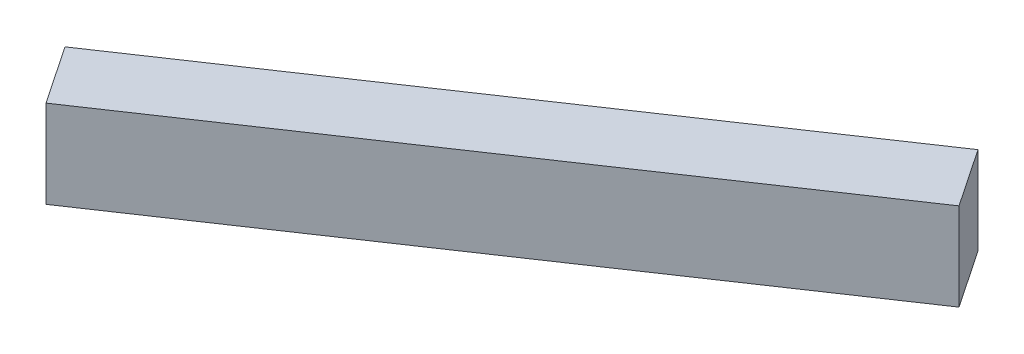
ISO-10303-21;
HEADER;
FILE_DESCRIPTION(('STEP AP214'),'2;1');
FILE_NAME('part.step','',(''),(''),'','','');
FILE_SCHEMA(('AUTOMOTIVE_DESIGN { 1 0 10303 214 1 1 1 1 }'));
ENDSEC;
DATA;
#1=APPLICATION_CONTEXT('core data for automotive mechanical design processes');
#2=APPLICATION_PROTOCOL_DEFINITION('international standard','automotive_design',2000,#1);
#3=PRODUCT_CONTEXT('',#1,'mechanical');
#4=PRODUCT('Part','Part','',(#3));
#5=PRODUCT_RELATED_PRODUCT_CATEGORY('part','',(#4));
#6=PRODUCT_DEFINITION_FORMATION('','',#4);
#7=PRODUCT_DEFINITION_CONTEXT('part definition',#1,'design');
#8=PRODUCT_DEFINITION('design','',#6,#7);
#9=PRODUCT_DEFINITION_SHAPE('','',#8);
#10=(LENGTH_UNIT() NAMED_UNIT(*) SI_UNIT(.MILLI.,.METRE.));
#11=(NAMED_UNIT(*) PLANE_ANGLE_UNIT() SI_UNIT($,.RADIAN.));
#12=(NAMED_UNIT(*) SI_UNIT($,.STERADIAN.) SOLID_ANGLE_UNIT());
#13=UNCERTAINTY_MEASURE_WITH_UNIT(LENGTH_MEASURE(1.E-05),#10,'distance_accuracy_value','');
#14=(GEOMETRIC_REPRESENTATION_CONTEXT(3) GLOBAL_UNCERTAINTY_ASSIGNED_CONTEXT((#13)) GLOBAL_UNIT_ASSIGNED_CONTEXT((#10,
#11,#12)) REPRESENTATION_CONTEXT('',''));
#15=CARTESIAN_POINT('',(0.,0.,0.));
#16=DIRECTION('',(0.,0.,1.));
#17=DIRECTION('',(1.,0.,0.));
#18=AXIS2_PLACEMENT_3D('',#15,#16,#17);
#19=CARTESIAN_POINT('',(-14.8695280097409,7.874,10.1385137063495));
#20=DIRECTION('',(-0.558681543794351,0.,-0.829382259650857));
#21=DIRECTION('',(-0.829382259650857,0.,0.558681543794351));
#22=AXIS2_PLACEMENT_3D('',#19,#20,#21);
#23=PLANE('',#22);
#24=DIRECTION('',(0.,1.,0.));
#25=VECTOR('',#24,1.);
#26=CARTESIAN_POINT('',(-14.8695280097409,7.874,10.1385137063495));
#27=LINE('',#26,#25);
#28=CARTESIAN_POINT('',(-14.8695280097409,7.62,10.1385137063495));
#29=VERTEX_POINT('',#28);
#30=CARTESIAN_POINT('',(-14.8695280097409,7.874,10.1385137063495));
#31=VERTEX_POINT('',#30);
#32=EDGE_CURVE('E20',#29,#31,#27,.T.);
#33=ORIENTED_EDGE('',*,*,#32,.T.);
#34=DIRECTION('',(-0.829382259650828,0.,0.558681543794393));
#35=VECTOR('',#34,1.);
#36=CARTESIAN_POINT('',(-14.8695280097409,7.874,10.1385137063495));
#37=LINE('',#36,#35);
#38=CARTESIAN_POINT('',(-16.4495012143757,7.874,11.2028020472778));
#39=VERTEX_POINT('',#38);
#40=EDGE_CURVE('E55',#31,#39,#37,.T.);
#41=ORIENTED_EDGE('',*,*,#40,.T.);
#42=DIRECTION('',(0.,1.,0.));
#43=VECTOR('',#42,1.);
#44=CARTESIAN_POINT('',(-16.4495012143757,7.874,11.2028020472778));
#45=LINE('',#44,#43);
#46=CARTESIAN_POINT('',(-16.4495012143757,7.62,11.2028020472778));
#47=VERTEX_POINT('',#46);
#48=EDGE_CURVE('E76',#39,#47,#45,.F.);
#49=ORIENTED_EDGE('',*,*,#48,.T.);
#50=DIRECTION('',(-0.829382259650828,0.,0.558681543794393));
#51=VECTOR('',#50,1.);
#52=CARTESIAN_POINT('',(-14.8695280097409,7.62,10.1385137063495));
#53=LINE('',#52,#51);
#54=EDGE_CURVE('E58',#29,#47,#53,.T.);
#55=ORIENTED_EDGE('',*,*,#54,.F.);
#56=EDGE_LOOP('',(#33,#41,#49,#55));
#57=FACE_BOUND('',#56,.T.);
#58=ADVANCED_FACE('F17',(#57),#23,.F.);
#59=CARTESIAN_POINT('',(-14.8695280097409,7.874,10.1385137063495));
#60=DIRECTION('',(-0.82938225965083,0.,0.55868154379439));
#61=DIRECTION('',(0.55868154379439,0.,0.82938225965083));
#62=AXIS2_PLACEMENT_3D('',#59,#60,#61);
#63=PLANE('',#62);
#64=DIRECTION('',(0.,1.,0.));
#65=VECTOR('',#64,1.);
#66=CARTESIAN_POINT('',(-14.9830520994399,7.874,9.9699832311885));
#67=LINE('',#66,#65);
#68=CARTESIAN_POINT('',(-14.9830520994399,7.62,9.9699832311885));
#69=VERTEX_POINT('',#68);
#70=CARTESIAN_POINT('',(-14.9830520994399,7.874,9.9699832311885));
#71=VERTEX_POINT('',#70);
#72=EDGE_CURVE('E73',#69,#71,#67,.T.);
#73=ORIENTED_EDGE('',*,*,#72,.T.);
#74=DIRECTION('',(0.558681543794436,0.,0.829382259650799));
#75=VECTOR('',#74,1.);
#76=CARTESIAN_POINT('',(-14.9830520994399,7.874,9.9699832311885));
#77=LINE('',#76,#75);
#78=EDGE_CURVE('E63',#71,#31,#77,.T.);
#79=ORIENTED_EDGE('',*,*,#78,.T.);
#80=ORIENTED_EDGE('',*,*,#32,.F.);
#81=DIRECTION('',(0.558681543794436,0.,0.829382259650799));
#82=VECTOR('',#81,1.);
#83=CARTESIAN_POINT('',(-14.9830520994399,7.62,9.9699832311885));
#84=LINE('',#83,#82);
#85=EDGE_CURVE('E80',#69,#29,#84,.T.);
#86=ORIENTED_EDGE('',*,*,#85,.F.);
#87=EDGE_LOOP('',(#73,#79,#80,#86));
#88=FACE_BOUND('',#87,.T.);
#89=ADVANCED_FACE('F72',(#88),#63,.F.);
#90=CARTESIAN_POINT('',(-14.8695280097409,7.874,10.1385137063495));
#91=DIRECTION('',(0.,-1.,0.));
#92=DIRECTION('',(0.,0.,-1.));
#93=AXIS2_PLACEMENT_3D('',#90,#91,#92);
#94=PLANE('',#93);
#95=ORIENTED_EDGE('',*,*,#78,.F.);
#96=DIRECTION('',(0.829382259650856,0.,-0.558681543794352));
#97=VECTOR('',#96,1.);
#98=CARTESIAN_POINT('',(-14.9830520994399,7.874,9.9699832311885));
#99=LINE('',#98,#97);
#100=CARTESIAN_POINT('',(-16.5630253043313,7.874,11.0342715722896));
#101=VERTEX_POINT('',#100);
#102=EDGE_CURVE('E83',#71,#101,#99,.F.);
#103=ORIENTED_EDGE('',*,*,#102,.T.);
#104=DIRECTION('',(-0.55868154505694,0.,-0.829382258800362));
#105=VECTOR('',#104,1.);
#106=CARTESIAN_POINT('',(-16.4495012143757,7.874,11.2028020472778));
#107=LINE('',#106,#105);
#108=EDGE_CURVE('E69',#101,#39,#107,.F.);
#109=ORIENTED_EDGE('',*,*,#108,.T.);
#110=ORIENTED_EDGE('',*,*,#40,.F.);
#111=EDGE_LOOP('',(#95,#103,#109,#110));
#112=FACE_BOUND('',#111,.T.);
#113=ADVANCED_FACE('F66',(#112),#94,.F.);
#114=CARTESIAN_POINT('',(-16.4495012143757,7.874,11.2028020472778));
#115=DIRECTION('',(0.829382258800362,0.,-0.55868154505694));
#116=DIRECTION('',(-0.55868154505694,0.,-0.829382258800362));
#117=AXIS2_PLACEMENT_3D('',#114,#115,#116);
#118=PLANE('',#117);
#119=ORIENTED_EDGE('',*,*,#48,.F.);
#120=ORIENTED_EDGE('',*,*,#108,.F.);
#121=DIRECTION('',(0.,1.,0.));
#122=VECTOR('',#121,1.);
#123=CARTESIAN_POINT('',(-16.5630253043313,7.874,11.0342715722896));
#124=LINE('',#123,#122);
#125=CARTESIAN_POINT('',(-16.5630253043313,7.62,11.0342715722896));
#126=VERTEX_POINT('',#125);
#127=EDGE_CURVE('E26',#101,#126,#124,.F.);
#128=ORIENTED_EDGE('',*,*,#127,.T.);
#129=DIRECTION('',(-0.558681545057125,0.,-0.829382258800237));
#130=VECTOR('',#129,1.);
#131=CARTESIAN_POINT('',(-16.4495012143757,7.62,11.2028020472778));
#132=LINE('',#131,#130);
#133=EDGE_CURVE('E34',#47,#126,#132,.T.);
#134=ORIENTED_EDGE('',*,*,#133,.F.);
#135=EDGE_LOOP('',(#119,#120,#128,#134));
#136=FACE_BOUND('',#135,.T.);
#137=ADVANCED_FACE('F88',(#136),#118,.F.);
#138=CARTESIAN_POINT('',(-14.8695280097409,7.62,10.1385137063495));
#139=DIRECTION('',(0.,-1.,0.));
#140=DIRECTION('',(0.,0.,-1.));
#141=AXIS2_PLACEMENT_3D('',#138,#139,#140);
#142=PLANE('',#141);
#143=DIRECTION('',(0.829382259650856,0.,-0.558681543794352));
#144=VECTOR('',#143,1.);
#145=CARTESIAN_POINT('',(-14.9830520994399,7.62,9.9699832311885));
#146=LINE('',#145,#144);
#147=EDGE_CURVE('E11',#126,#69,#146,.T.);
#148=ORIENTED_EDGE('',*,*,#147,.T.);
#149=ORIENTED_EDGE('',*,*,#85,.T.);
#150=ORIENTED_EDGE('',*,*,#54,.T.);
#151=ORIENTED_EDGE('',*,*,#133,.T.);
#152=EDGE_LOOP('',(#148,#149,#150,#151));
#153=FACE_BOUND('',#152,.T.);
#154=ADVANCED_FACE('F91',(#153),#142,.T.);
#155=CARTESIAN_POINT('',(-14.9830520994399,7.874,9.9699832311885));
#156=DIRECTION('',(0.558681543794352,0.,0.829382259650856));
#157=DIRECTION('',(0.829382259650856,0.,-0.558681543794352));
#158=AXIS2_PLACEMENT_3D('',#155,#156,#157);
#159=PLANE('',#158);
#160=ORIENTED_EDGE('',*,*,#127,.F.);
#161=ORIENTED_EDGE('',*,*,#102,.F.);
#162=ORIENTED_EDGE('',*,*,#72,.F.);
#163=ORIENTED_EDGE('',*,*,#147,.F.);
#164=EDGE_LOOP('',(#160,#161,#162,#163));
#165=FACE_BOUND('',#164,.T.);
#166=ADVANCED_FACE('F90',(#165),#159,.F.);
#167=CLOSED_SHELL('',(#58,#89,#113,#137,#154,#166));
#168=MANIFOLD_SOLID_BREP('B1',#167);
#169=ADVANCED_BREP_SHAPE_REPRESENTATION('',(#18,#168),#14);
#170=SHAPE_DEFINITION_REPRESENTATION(#9,#169);
ENDSEC;
END-ISO-10303-21;
